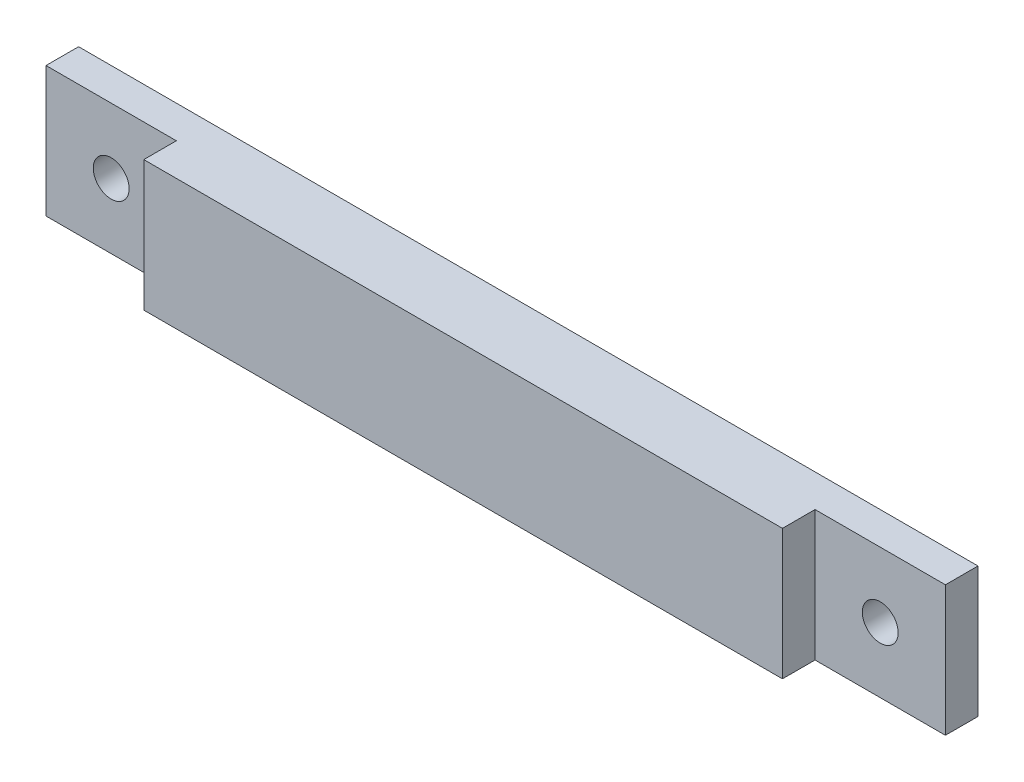
ISO-10303-21;
HEADER;
FILE_DESCRIPTION(('STEP AP214'),'2;1');
FILE_NAME('part.step','',(''),(''),'','','');
FILE_SCHEMA(('AUTOMOTIVE_DESIGN { 1 0 10303 214 1 1 1 1 }'));
ENDSEC;
DATA;
#1=APPLICATION_CONTEXT('core data for automotive mechanical design processes');
#2=APPLICATION_PROTOCOL_DEFINITION('international standard','automotive_design',2000,#1);
#3=PRODUCT_CONTEXT('',#1,'mechanical');
#4=PRODUCT('Part','Part','',(#3));
#5=PRODUCT_RELATED_PRODUCT_CATEGORY('part','',(#4));
#6=PRODUCT_DEFINITION_FORMATION('','',#4);
#7=PRODUCT_DEFINITION_CONTEXT('part definition',#1,'design');
#8=PRODUCT_DEFINITION('design','',#6,#7);
#9=PRODUCT_DEFINITION_SHAPE('','',#8);
#10=(LENGTH_UNIT() NAMED_UNIT(*) SI_UNIT(.MILLI.,.METRE.));
#11=(NAMED_UNIT(*) PLANE_ANGLE_UNIT() SI_UNIT($,.RADIAN.));
#12=(NAMED_UNIT(*) SI_UNIT($,.STERADIAN.) SOLID_ANGLE_UNIT());
#13=UNCERTAINTY_MEASURE_WITH_UNIT(LENGTH_MEASURE(1.E-05),#10,'distance_accuracy_value','');
#14=(GEOMETRIC_REPRESENTATION_CONTEXT(3) GLOBAL_UNCERTAINTY_ASSIGNED_CONTEXT((#13)) GLOBAL_UNIT_ASSIGNED_CONTEXT((#10,
#11,#12)) REPRESENTATION_CONTEXT('',''));
#15=CARTESIAN_POINT('',(0.,0.,0.));
#16=DIRECTION('',(0.,0.,1.));
#17=DIRECTION('',(1.,0.,0.));
#18=AXIS2_PLACEMENT_3D('',#15,#16,#17);
#19=CARTESIAN_POINT('',(0.,0.,10.));
#20=DIRECTION('',(0.,0.,1.));
#21=DIRECTION('',(1.,0.,0.));
#22=AXIS2_PLACEMENT_3D('',#19,#20,#21);
#23=PLANE('',#22);
#24=CARTESIAN_POINT('',(20.,20.,10.));
#25=DIRECTION('',(0.,0.,1.));
#26=DIRECTION('',(1.,0.,0.));
#27=AXIS2_PLACEMENT_3D('',#24,#25,#26);
#28=CIRCLE('',#27,5.5);
#29=CARTESIAN_POINT('',(25.5,20.,10.));
#30=VERTEX_POINT('',#29);
#31=EDGE_CURVE('E154',#30,#30,#28,.T.);
#32=ORIENTED_EDGE('',*,*,#31,.F.);
#33=EDGE_LOOP('',(#32));
#34=FACE_BOUND('',#33,.T.);
#35=DIRECTION('',(1.,0.,0.));
#36=VECTOR('',#35,1.);
#37=CARTESIAN_POINT('',(0.,0.,10.));
#38=LINE('',#37,#36);
#39=CARTESIAN_POINT('',(0.,0.,10.));
#40=VERTEX_POINT('',#39);
#41=CARTESIAN_POINT('',(40.,0.,10.));
#42=VERTEX_POINT('',#41);
#43=EDGE_CURVE('E162',#40,#42,#38,.T.);
#44=ORIENTED_EDGE('',*,*,#43,.T.);
#45=DIRECTION('',(0.,1.,0.));
#46=VECTOR('',#45,1.);
#47=CARTESIAN_POINT('',(40.,0.,10.));
#48=LINE('',#47,#46);
#49=CARTESIAN_POINT('',(40.,40.,10.));
#50=VERTEX_POINT('',#49);
#51=EDGE_CURVE('E63',#42,#50,#48,.T.);
#52=ORIENTED_EDGE('',*,*,#51,.T.);
#53=DIRECTION('',(-1.,0.,0.));
#54=VECTOR('',#53,1.);
#55=CARTESIAN_POINT('',(0.,40.,10.));
#56=LINE('',#55,#54);
#57=CARTESIAN_POINT('',(0.,40.,10.));
#58=VERTEX_POINT('',#57);
#59=EDGE_CURVE('E168',#50,#58,#56,.T.);
#60=ORIENTED_EDGE('',*,*,#59,.T.);
#61=DIRECTION('',(0.,-1.,0.));
#62=VECTOR('',#61,1.);
#63=CARTESIAN_POINT('',(0.,0.,10.));
#64=LINE('',#63,#62);
#65=EDGE_CURVE('E172',#58,#40,#64,.T.);
#66=ORIENTED_EDGE('',*,*,#65,.T.);
#67=EDGE_LOOP('',(#44,#52,#60,#66));
#68=FACE_BOUND('',#67,.T.);
#69=ADVANCED_FACE('F47',(#34,#68),#23,.T.);
#70=DIRECTION('',(0.,1.,0.));
#71=VECTOR('',#70,1.);
#72=CARTESIAN_POINT('',(235.97,0.,10.));
#73=LINE('',#72,#71);
#74=CARTESIAN_POINT('',(235.97,0.,10.));
#75=VERTEX_POINT('',#74);
#76=CARTESIAN_POINT('',(235.97,40.,10.));
#77=VERTEX_POINT('',#76);
#78=EDGE_CURVE('E71',#75,#77,#73,.T.);
#79=ORIENTED_EDGE('',*,*,#78,.F.);
#80=CARTESIAN_POINT('',(275.97,0.,10.));
#81=VERTEX_POINT('',#80);
#82=EDGE_CURVE('E137',#75,#81,#38,.T.);
#83=ORIENTED_EDGE('',*,*,#82,.T.);
#84=DIRECTION('',(0.,1.,0.));
#85=VECTOR('',#84,1.);
#86=CARTESIAN_POINT('',(275.97,0.,10.));
#87=LINE('',#86,#85);
#88=CARTESIAN_POINT('',(275.97,40.,10.));
#89=VERTEX_POINT('',#88);
#90=EDGE_CURVE('E165',#81,#89,#87,.T.);
#91=ORIENTED_EDGE('',*,*,#90,.T.);
#92=EDGE_CURVE('E169',#89,#77,#56,.T.);
#93=ORIENTED_EDGE('',*,*,#92,.T.);
#94=EDGE_LOOP('',(#79,#83,#91,#93));
#95=FACE_BOUND('',#94,.T.);
#96=CARTESIAN_POINT('',(255.97,20.,10.));
#97=DIRECTION('',(0.,0.,1.));
#98=DIRECTION('',(-1.,0.,0.));
#99=AXIS2_PLACEMENT_3D('',#96,#97,#98);
#100=CIRCLE('',#99,5.50000000000002);
#101=CARTESIAN_POINT('',(250.47,20.,10.));
#102=VERTEX_POINT('',#101);
#103=EDGE_CURVE('E144',#102,#102,#100,.T.);
#104=ORIENTED_EDGE('',*,*,#103,.F.);
#105=EDGE_LOOP('',(#104));
#106=FACE_BOUND('',#105,.T.);
#107=ADVANCED_FACE('F218',(#95,#106),#23,.T.);
#108=CARTESIAN_POINT('',(0.,0.,0.));
#109=DIRECTION('',(0.,0.,1.));
#110=DIRECTION('',(1.,0.,0.));
#111=AXIS2_PLACEMENT_3D('',#108,#109,#110);
#112=PLANE('',#111);
#113=DIRECTION('',(1.,0.,0.));
#114=VECTOR('',#113,1.);
#115=CARTESIAN_POINT('',(0.,0.,0.));
#116=LINE('',#115,#114);
#117=CARTESIAN_POINT('',(0.,0.,0.));
#118=VERTEX_POINT('',#117);
#119=CARTESIAN_POINT('',(275.97,0.,0.));
#120=VERTEX_POINT('',#119);
#121=EDGE_CURVE('E158',#118,#120,#116,.T.);
#122=ORIENTED_EDGE('',*,*,#121,.F.);
#123=DIRECTION('',(0.,-1.,0.));
#124=VECTOR('',#123,1.);
#125=CARTESIAN_POINT('',(0.,0.,0.));
#126=LINE('',#125,#124);
#127=CARTESIAN_POINT('',(0.,40.,0.));
#128=VERTEX_POINT('',#127);
#129=EDGE_CURVE('E184',#128,#118,#126,.T.);
#130=ORIENTED_EDGE('',*,*,#129,.F.);
#131=DIRECTION('',(-1.,0.,0.));
#132=VECTOR('',#131,1.);
#133=CARTESIAN_POINT('',(0.,40.,0.));
#134=LINE('',#133,#132);
#135=CARTESIAN_POINT('',(275.97,40.,0.));
#136=VERTEX_POINT('',#135);
#137=EDGE_CURVE('E181',#136,#128,#134,.T.);
#138=ORIENTED_EDGE('',*,*,#137,.F.);
#139=DIRECTION('',(0.,1.,0.));
#140=VECTOR('',#139,1.);
#141=CARTESIAN_POINT('',(275.97,0.,0.));
#142=LINE('',#141,#140);
#143=EDGE_CURVE('E178',#120,#136,#142,.T.);
#144=ORIENTED_EDGE('',*,*,#143,.F.);
#145=EDGE_LOOP('',(#122,#130,#138,#144));
#146=FACE_BOUND('',#145,.T.);
#147=CARTESIAN_POINT('',(20.,20.,0.));
#148=DIRECTION('',(0.,0.,1.));
#149=DIRECTION('',(1.,0.,0.));
#150=AXIS2_PLACEMENT_3D('',#147,#148,#149);
#151=CIRCLE('',#150,5.5);
#152=CARTESIAN_POINT('',(25.5,20.,0.));
#153=VERTEX_POINT('',#152);
#154=EDGE_CURVE('E152',#153,#153,#151,.T.);
#155=ORIENTED_EDGE('',*,*,#154,.T.);
#156=EDGE_LOOP('',(#155));
#157=FACE_BOUND('',#156,.T.);
#158=CARTESIAN_POINT('',(255.97,20.,0.));
#159=DIRECTION('',(0.,0.,1.));
#160=DIRECTION('',(-1.,0.,0.));
#161=AXIS2_PLACEMENT_3D('',#158,#159,#160);
#162=CIRCLE('',#161,5.50000000000002);
#163=CARTESIAN_POINT('',(250.47,20.,0.));
#164=VERTEX_POINT('',#163);
#165=EDGE_CURVE('E139',#164,#164,#162,.T.);
#166=ORIENTED_EDGE('',*,*,#165,.T.);
#167=EDGE_LOOP('',(#166));
#168=FACE_BOUND('',#167,.T.);
#169=ADVANCED_FACE('F206',(#146,#157,#168),#112,.F.);
#170=CARTESIAN_POINT('',(0.,0.,10.));
#171=DIRECTION('',(0.,1.,0.));
#172=DIRECTION('',(0.,0.,1.));
#173=AXIS2_PLACEMENT_3D('',#170,#171,#172);
#174=PLANE('',#173);
#175=ORIENTED_EDGE('',*,*,#121,.T.);
#176=DIRECTION('',(0.,0.,-1.));
#177=VECTOR('',#176,1.);
#178=CARTESIAN_POINT('',(275.97,0.,10.));
#179=LINE('',#178,#177);
#180=EDGE_CURVE('E11',#81,#120,#179,.T.);
#181=ORIENTED_EDGE('',*,*,#180,.F.);
#182=ORIENTED_EDGE('',*,*,#82,.F.);
#183=DIRECTION('',(0.,0.,-1.));
#184=VECTOR('',#183,1.);
#185=CARTESIAN_POINT('',(235.97,0.,20.));
#186=LINE('',#185,#184);
#187=CARTESIAN_POINT('',(235.97,0.,20.));
#188=VERTEX_POINT('',#187);
#189=EDGE_CURVE('E117',#188,#75,#186,.T.);
#190=ORIENTED_EDGE('',*,*,#189,.F.);
#191=DIRECTION('',(1.,0.,0.));
#192=VECTOR('',#191,1.);
#193=CARTESIAN_POINT('',(0.,0.,20.));
#194=LINE('',#193,#192);
#195=CARTESIAN_POINT('',(40.,0.,20.));
#196=VERTEX_POINT('',#195);
#197=EDGE_CURVE('E124',#196,#188,#194,.T.);
#198=ORIENTED_EDGE('',*,*,#197,.F.);
#199=DIRECTION('',(0.,0.,-1.));
#200=VECTOR('',#199,1.);
#201=CARTESIAN_POINT('',(40.,0.,20.));
#202=LINE('',#201,#200);
#203=EDGE_CURVE('E213',#196,#42,#202,.T.);
#204=ORIENTED_EDGE('',*,*,#203,.T.);
#205=ORIENTED_EDGE('',*,*,#43,.F.);
#206=DIRECTION('',(0.,0.,-1.));
#207=VECTOR('',#206,1.);
#208=CARTESIAN_POINT('',(0.,0.,10.));
#209=LINE('',#208,#207);
#210=EDGE_CURVE('E175',#40,#118,#209,.T.);
#211=ORIENTED_EDGE('',*,*,#210,.T.);
#212=EDGE_LOOP('',(#175,#181,#182,#190,#198,#204,#205,#211));
#213=FACE_BOUND('',#212,.T.);
#214=ADVANCED_FACE('F49',(#213),#174,.F.);
#215=CARTESIAN_POINT('',(275.97,0.,10.));
#216=DIRECTION('',(-1.,0.,0.));
#217=DIRECTION('',(0.,0.,1.));
#218=AXIS2_PLACEMENT_3D('',#215,#216,#217);
#219=PLANE('',#218);
#220=ORIENTED_EDGE('',*,*,#143,.T.);
#221=DIRECTION('',(0.,0.,-1.));
#222=VECTOR('',#221,1.);
#223=CARTESIAN_POINT('',(275.97,40.,10.));
#224=LINE('',#223,#222);
#225=EDGE_CURVE('E56',#89,#136,#224,.T.);
#226=ORIENTED_EDGE('',*,*,#225,.F.);
#227=ORIENTED_EDGE('',*,*,#90,.F.);
#228=ORIENTED_EDGE('',*,*,#180,.T.);
#229=EDGE_LOOP('',(#220,#226,#227,#228));
#230=FACE_BOUND('',#229,.T.);
#231=ADVANCED_FACE('F220',(#230),#219,.F.);
#232=CARTESIAN_POINT('',(0.,40.,10.));
#233=DIRECTION('',(0.,-1.,0.));
#234=DIRECTION('',(0.,0.,-1.));
#235=AXIS2_PLACEMENT_3D('',#232,#233,#234);
#236=PLANE('',#235);
#237=ORIENTED_EDGE('',*,*,#137,.T.);
#238=DIRECTION('',(0.,0.,-1.));
#239=VECTOR('',#238,1.);
#240=CARTESIAN_POINT('',(0.,40.,10.));
#241=LINE('',#240,#239);
#242=EDGE_CURVE('E190',#58,#128,#241,.T.);
#243=ORIENTED_EDGE('',*,*,#242,.F.);
#244=ORIENTED_EDGE('',*,*,#59,.F.);
#245=DIRECTION('',(0.,0.,-1.));
#246=VECTOR('',#245,1.);
#247=CARTESIAN_POINT('',(40.,40.,20.));
#248=LINE('',#247,#246);
#249=CARTESIAN_POINT('',(40.,40.,20.));
#250=VERTEX_POINT('',#249);
#251=EDGE_CURVE('E146',#250,#50,#248,.T.);
#252=ORIENTED_EDGE('',*,*,#251,.F.);
#253=DIRECTION('',(-1.,0.,0.));
#254=VECTOR('',#253,1.);
#255=CARTESIAN_POINT('',(0.,40.,20.));
#256=LINE('',#255,#254);
#257=CARTESIAN_POINT('',(235.97,40.,20.));
#258=VERTEX_POINT('',#257);
#259=EDGE_CURVE('E123',#258,#250,#256,.T.);
#260=ORIENTED_EDGE('',*,*,#259,.F.);
#261=DIRECTION('',(0.,0.,-1.));
#262=VECTOR('',#261,1.);
#263=CARTESIAN_POINT('',(235.97,40.,20.));
#264=LINE('',#263,#262);
#265=EDGE_CURVE('E119',#258,#77,#264,.T.);
#266=ORIENTED_EDGE('',*,*,#265,.T.);
#267=ORIENTED_EDGE('',*,*,#92,.F.);
#268=ORIENTED_EDGE('',*,*,#225,.T.);
#269=EDGE_LOOP('',(#237,#243,#244,#252,#260,#266,#267,#268));
#270=FACE_BOUND('',#269,.T.);
#271=ADVANCED_FACE('F199',(#270),#236,.F.);
#272=CARTESIAN_POINT('',(0.,0.,10.));
#273=DIRECTION('',(1.,0.,0.));
#274=DIRECTION('',(0.,0.,-1.));
#275=AXIS2_PLACEMENT_3D('',#272,#273,#274);
#276=PLANE('',#275);
#277=ORIENTED_EDGE('',*,*,#129,.T.);
#278=ORIENTED_EDGE('',*,*,#210,.F.);
#279=ORIENTED_EDGE('',*,*,#65,.F.);
#280=ORIENTED_EDGE('',*,*,#242,.T.);
#281=EDGE_LOOP('',(#277,#278,#279,#280));
#282=FACE_BOUND('',#281,.T.);
#283=ADVANCED_FACE('F210',(#282),#276,.F.);
#284=CARTESIAN_POINT('',(20.,20.,10.));
#285=DIRECTION('',(0.,0.,-1.));
#286=DIRECTION('',(-1.,0.,0.));
#287=AXIS2_PLACEMENT_3D('',#284,#285,#286);
#288=CYLINDRICAL_SURFACE('',#287,5.5);
#289=ORIENTED_EDGE('',*,*,#31,.T.);
#290=EDGE_LOOP('',(#289));
#291=FACE_BOUND('',#290,.T.);
#292=ORIENTED_EDGE('',*,*,#154,.F.);
#293=EDGE_LOOP('',(#292));
#294=FACE_BOUND('',#293,.T.);
#295=ADVANCED_FACE('F239',(#291,#294),#288,.F.);
#296=CARTESIAN_POINT('',(255.97,20.,10.));
#297=DIRECTION('',(0.,0.,-1.));
#298=DIRECTION('',(-1.,0.,0.));
#299=AXIS2_PLACEMENT_3D('',#296,#297,#298);
#300=CYLINDRICAL_SURFACE('',#299,5.50000000000002);
#301=ORIENTED_EDGE('',*,*,#103,.T.);
#302=EDGE_LOOP('',(#301));
#303=FACE_BOUND('',#302,.T.);
#304=ORIENTED_EDGE('',*,*,#165,.F.);
#305=EDGE_LOOP('',(#304));
#306=FACE_BOUND('',#305,.T.);
#307=ADVANCED_FACE('F245',(#303,#306),#300,.F.);
#308=CARTESIAN_POINT('',(235.97,0.,20.));
#309=DIRECTION('',(-1.,0.,0.));
#310=DIRECTION('',(0.,0.,1.));
#311=AXIS2_PLACEMENT_3D('',#308,#309,#310);
#312=PLANE('',#311);
#313=ORIENTED_EDGE('',*,*,#78,.T.);
#314=ORIENTED_EDGE('',*,*,#265,.F.);
#315=DIRECTION('',(0.,1.,0.));
#316=VECTOR('',#315,1.);
#317=CARTESIAN_POINT('',(235.97,0.,20.));
#318=LINE('',#317,#316);
#319=EDGE_CURVE('E113',#188,#258,#318,.T.);
#320=ORIENTED_EDGE('',*,*,#319,.F.);
#321=ORIENTED_EDGE('',*,*,#189,.T.);
#322=EDGE_LOOP('',(#313,#314,#320,#321));
#323=FACE_BOUND('',#322,.T.);
#324=ADVANCED_FACE('F115',(#323),#312,.F.);
#325=CARTESIAN_POINT('',(40.,0.,20.));
#326=DIRECTION('',(-1.,0.,0.));
#327=DIRECTION('',(0.,0.,1.));
#328=AXIS2_PLACEMENT_3D('',#325,#326,#327);
#329=PLANE('',#328);
#330=ORIENTED_EDGE('',*,*,#51,.F.);
#331=ORIENTED_EDGE('',*,*,#203,.F.);
#332=DIRECTION('',(0.,1.,0.));
#333=VECTOR('',#332,1.);
#334=CARTESIAN_POINT('',(40.,0.,20.));
#335=LINE('',#334,#333);
#336=EDGE_CURVE('E130',#196,#250,#335,.T.);
#337=ORIENTED_EDGE('',*,*,#336,.T.);
#338=ORIENTED_EDGE('',*,*,#251,.T.);
#339=EDGE_LOOP('',(#330,#331,#337,#338));
#340=FACE_BOUND('',#339,.T.);
#341=ADVANCED_FACE('F258',(#340),#329,.T.);
#342=CARTESIAN_POINT('',(0.,0.,20.));
#343=DIRECTION('',(0.,0.,1.));
#344=DIRECTION('',(1.,0.,0.));
#345=AXIS2_PLACEMENT_3D('',#342,#343,#344);
#346=PLANE('',#345);
#347=ORIENTED_EDGE('',*,*,#197,.T.);
#348=ORIENTED_EDGE('',*,*,#319,.T.);
#349=ORIENTED_EDGE('',*,*,#259,.T.);
#350=ORIENTED_EDGE('',*,*,#336,.F.);
#351=EDGE_LOOP('',(#347,#348,#349,#350));
#352=FACE_BOUND('',#351,.T.);
#353=ADVANCED_FACE('F128',(#352),#346,.T.);
#354=CLOSED_SHELL('',(#69,#107,#169,#214,#231,#271,#283,#295,#307,#324,#341,#353));
#355=MANIFOLD_SOLID_BREP('B2',#354);
#356=ADVANCED_BREP_SHAPE_REPRESENTATION('',(#18,#355),#14);
#357=SHAPE_DEFINITION_REPRESENTATION(#9,#356);
ENDSEC;
END-ISO-10303-21;
